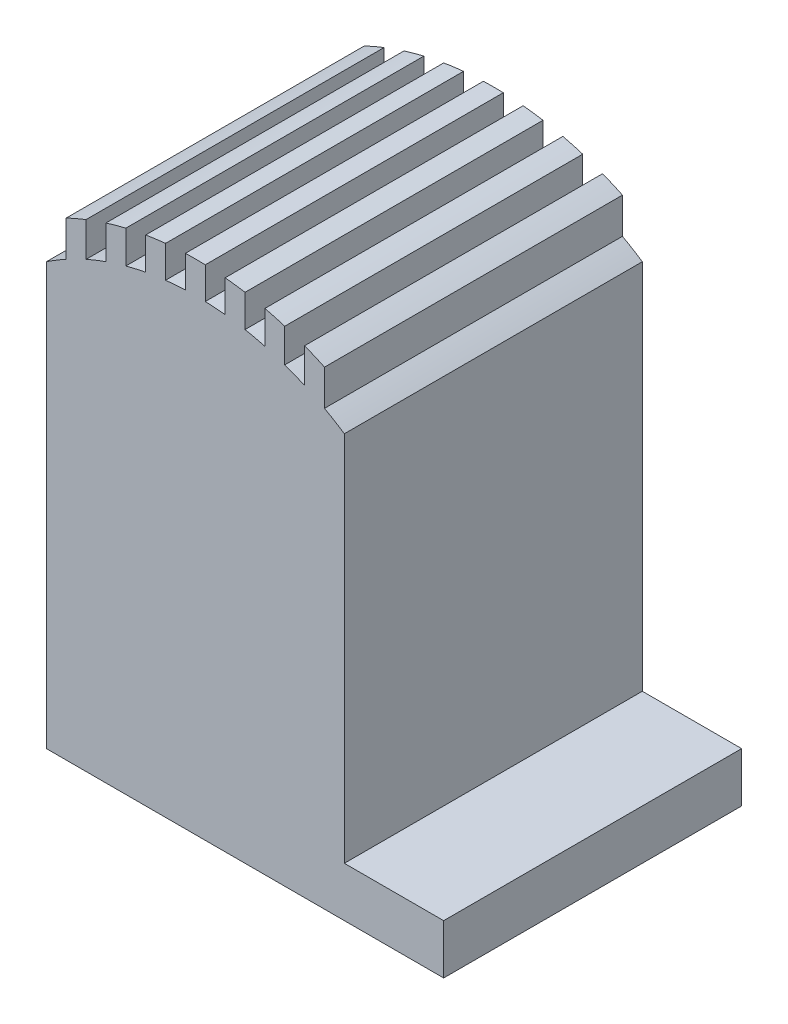
ISO-10303-21;
HEADER;
FILE_DESCRIPTION(('STEP AP214'),'2;1');
FILE_NAME('part.step','',(''),(''),'','','');
FILE_SCHEMA(('AUTOMOTIVE_DESIGN { 1 0 10303 214 1 1 1 1 }'));
ENDSEC;
DATA;
#1=APPLICATION_CONTEXT('core data for automotive mechanical design processes');
#2=APPLICATION_PROTOCOL_DEFINITION('international standard','automotive_design',2000,#1);
#3=PRODUCT_CONTEXT('',#1,'mechanical');
#4=PRODUCT('Part','Part','',(#3));
#5=PRODUCT_RELATED_PRODUCT_CATEGORY('part','',(#4));
#6=PRODUCT_DEFINITION_FORMATION('','',#4);
#7=PRODUCT_DEFINITION_CONTEXT('part definition',#1,'design');
#8=PRODUCT_DEFINITION('design','',#6,#7);
#9=PRODUCT_DEFINITION_SHAPE('','',#8);
#10=(LENGTH_UNIT() NAMED_UNIT(*) SI_UNIT(.MILLI.,.METRE.));
#11=(NAMED_UNIT(*) PLANE_ANGLE_UNIT() SI_UNIT($,.RADIAN.));
#12=(NAMED_UNIT(*) SI_UNIT($,.STERADIAN.) SOLID_ANGLE_UNIT());
#13=UNCERTAINTY_MEASURE_WITH_UNIT(LENGTH_MEASURE(1.E-05),#10,'distance_accuracy_value','');
#14=(GEOMETRIC_REPRESENTATION_CONTEXT(3) GLOBAL_UNCERTAINTY_ASSIGNED_CONTEXT((#13)) GLOBAL_UNIT_ASSIGNED_CONTEXT((#10,
#11,#12)) REPRESENTATION_CONTEXT('',''));
#15=CARTESIAN_POINT('',(0.,0.,0.));
#16=DIRECTION('',(0.,0.,1.));
#17=DIRECTION('',(1.,0.,0.));
#18=AXIS2_PLACEMENT_3D('',#15,#16,#17);
#19=CARTESIAN_POINT('',(-0.635,1.27,-1.905));
#20=DIRECTION('',(0.,0.,1.));
#21=DIRECTION('',(1.,0.,0.));
#22=AXIS2_PLACEMENT_3D('',#19,#20,#21);
#23=PLANE('',#22);
#24=CARTESIAN_POINT('',(-0.635,1.27,-1.905));
#25=DIRECTION('',(0.,0.,1.));
#26=DIRECTION('',(1.,0.,0.));
#27=AXIS2_PLACEMENT_3D('',#24,#25,#26);
#28=CIRCLE('',#27,3.429);
#29=CARTESIAN_POINT('',(-2.286,4.275368529815,-1.905));
#30=VERTEX_POINT('',#29);
#31=CARTESIAN_POINT('',(-2.54,4.121142928722,-1.905));
#32=VERTEX_POINT('',#31);
#33=EDGE_CURVE('E501',#30,#32,#28,.T.);
#34=ORIENTED_EDGE('',*,*,#33,.F.);
#35=DIRECTION('',(0.,-1.,0.));
#36=VECTOR('',#35,1.);
#37=CARTESIAN_POINT('',(-2.286,4.7318625276,-1.905));
#38=LINE('',#37,#36);
#39=CARTESIAN_POINT('',(-2.286,4.7318625276,-1.905));
#40=VERTEX_POINT('',#39);
#41=EDGE_CURVE('E456',#40,#30,#38,.T.);
#42=ORIENTED_EDGE('',*,*,#41,.F.);
#43=CARTESIAN_POINT('',(-0.635,1.27,-1.905));
#44=DIRECTION('',(0.,0.,1.));
#45=DIRECTION('',(1.,0.,0.));
#46=AXIS2_PLACEMENT_3D('',#43,#44,#45);
#47=CIRCLE('',#46,3.8354);
#48=CARTESIAN_POINT('',(-2.032,4.841930032909,-1.905));
#49=VERTEX_POINT('',#48);
#50=EDGE_CURVE('E480',#49,#40,#47,.T.);
#51=ORIENTED_EDGE('',*,*,#50,.F.);
#52=DIRECTION('',(0.,1.,0.));
#53=VECTOR('',#52,1.);
#54=CARTESIAN_POINT('',(-2.032,4.401522313508,-1.905));
#55=LINE('',#54,#53);
#56=CARTESIAN_POINT('',(-2.032,4.401522313508,-1.905));
#57=VERTEX_POINT('',#56);
#58=EDGE_CURVE('E11',#57,#49,#55,.T.);
#59=ORIENTED_EDGE('',*,*,#58,.F.);
#60=CARTESIAN_POINT('',(-0.635,1.27,-1.905));
#61=DIRECTION('',(0.,0.,1.));
#62=DIRECTION('',(1.,0.,0.));
#63=AXIS2_PLACEMENT_3D('',#60,#61,#62);
#64=CIRCLE('',#63,3.429);
#65=CARTESIAN_POINT('',(-1.778,4.502892203585,-1.905));
#66=VERTEX_POINT('',#65);
#67=EDGE_CURVE('E426',#66,#57,#64,.T.);
#68=ORIENTED_EDGE('',*,*,#67,.F.);
#69=DIRECTION('',(0.,-1.,0.));
#70=VECTOR('',#69,1.);
#71=CARTESIAN_POINT('',(-1.778,4.931126078135,-1.905));
#72=LINE('',#71,#70);
#73=CARTESIAN_POINT('',(-1.778,4.931126078135,-1.905));
#74=VERTEX_POINT('',#73);
#75=EDGE_CURVE('E427',#74,#66,#72,.T.);
#76=ORIENTED_EDGE('',*,*,#75,.F.);
#77=CARTESIAN_POINT('',(-0.635,1.269999999999,-1.905));
#78=DIRECTION('',(0.,0.,1.));
#79=DIRECTION('',(1.,0.,0.));
#80=AXIS2_PLACEMENT_3D('',#77,#78,#79);
#81=CIRCLE('',#80,3.8354);
#82=CARTESIAN_POINT('',(-1.524,5.000947890282,-1.905));
#83=VERTEX_POINT('',#82);
#84=EDGE_CURVE('E394',#83,#74,#81,.T.);
#85=ORIENTED_EDGE('',*,*,#84,.F.);
#86=DIRECTION('',(0.,1.,0.));
#87=VECTOR('',#86,1.);
#88=CARTESIAN_POINT('',(-1.524,4.581754821843,-1.905));
#89=LINE('',#88,#87);
#90=CARTESIAN_POINT('',(-1.524,4.581754821843,-1.905));
#91=VERTEX_POINT('',#90);
#92=EDGE_CURVE('E395',#91,#83,#89,.T.);
#93=ORIENTED_EDGE('',*,*,#92,.F.);
#94=CARTESIAN_POINT('',(-0.635,1.27,-1.905));
#95=DIRECTION('',(0.,0.,1.));
#96=DIRECTION('',(1.,0.,0.));
#97=AXIS2_PLACEMENT_3D('',#94,#95,#96);
#98=CIRCLE('',#97,3.429);
#99=CARTESIAN_POINT('',(-1.27,4.639690787001,-1.905));
#100=VERTEX_POINT('',#99);
#101=EDGE_CURVE('E341',#100,#91,#98,.T.);
#102=ORIENTED_EDGE('',*,*,#101,.F.);
#103=DIRECTION('',(0.,-1.,0.));
#104=VECTOR('',#103,1.);
#105=CARTESIAN_POINT('',(-1.27,5.052468527298,-1.905));
#106=LINE('',#105,#104);
#107=CARTESIAN_POINT('',(-1.27,5.052468527298,-1.905));
#108=VERTEX_POINT('',#107);
#109=EDGE_CURVE('E342',#108,#100,#106,.T.);
#110=ORIENTED_EDGE('',*,*,#109,.F.);
#111=CARTESIAN_POINT('',(-0.635,1.269999999999,-1.905));
#112=DIRECTION('',(0.,0.,1.));
#113=DIRECTION('',(1.,0.,0.));
#114=AXIS2_PLACEMENT_3D('',#111,#112,#113);
#115=CIRCLE('',#114,3.8354);
#116=CARTESIAN_POINT('',(-1.016,5.086429242106,-1.905));
#117=VERTEX_POINT('',#116);
#118=EDGE_CURVE('E421',#117,#108,#115,.T.);
#119=ORIENTED_EDGE('',*,*,#118,.F.);
#120=DIRECTION('',(0.,1.,0.));
#121=VECTOR('',#120,1.);
#122=CARTESIAN_POINT('',(-1.016,4.67776759771,-1.905));
#123=LINE('',#122,#121);
#124=CARTESIAN_POINT('',(-1.016,4.67776759771,-1.905));
#125=VERTEX_POINT('',#124);
#126=EDGE_CURVE('E20',#125,#117,#123,.T.);
#127=ORIENTED_EDGE('',*,*,#126,.F.);
#128=CARTESIAN_POINT('',(-0.635,1.27,-1.905));
#129=DIRECTION('',(0.,0.,1.));
#130=DIRECTION('',(1.,0.,0.));
#131=AXIS2_PLACEMENT_3D('',#128,#129,#130);
#132=CIRCLE('',#131,3.429);
#133=CARTESIAN_POINT('',(-0.762,4.696647341061,-1.905));
#134=VERTEX_POINT('',#133);
#135=EDGE_CURVE('E306',#134,#125,#132,.T.);
#136=ORIENTED_EDGE('',*,*,#135,.F.);
#137=DIRECTION('',(0.,-1.,0.));
#138=VECTOR('',#137,1.);
#139=CARTESIAN_POINT('',(-0.762,5.103296774318,-1.905));
#140=LINE('',#139,#138);
#141=CARTESIAN_POINT('',(-0.762,5.103296774318,-1.905));
#142=VERTEX_POINT('',#141);
#143=EDGE_CURVE('E389',#142,#134,#140,.T.);
#144=ORIENTED_EDGE('',*,*,#143,.F.);
#145=CARTESIAN_POINT('',(-0.635,1.270000000001,-1.905));
#146=DIRECTION('',(0.,0.,1.));
#147=DIRECTION('',(1.,0.,0.));
#148=AXIS2_PLACEMENT_3D('',#145,#146,#147);
#149=CIRCLE('',#148,3.8354);
#150=CARTESIAN_POINT('',(-0.508,5.103296774318,-1.905));
#151=VERTEX_POINT('',#150);
#152=EDGE_CURVE('E464',#151,#142,#149,.T.);
#153=ORIENTED_EDGE('',*,*,#152,.F.);
#154=DIRECTION('',(0.,1.,0.));
#155=VECTOR('',#154,1.);
#156=CARTESIAN_POINT('',(-0.508,4.696647341061,-1.905));
#157=LINE('',#156,#155);
#158=CARTESIAN_POINT('',(-0.508,4.696647341061,-1.905));
#159=VERTEX_POINT('',#158);
#160=EDGE_CURVE('E572',#159,#151,#157,.T.);
#161=ORIENTED_EDGE('',*,*,#160,.F.);
#162=CARTESIAN_POINT('',(-0.635,1.270000000001,-1.905));
#163=DIRECTION('',(0.,0.,1.));
#164=DIRECTION('',(1.,0.,0.));
#165=AXIS2_PLACEMENT_3D('',#162,#163,#164);
#166=CIRCLE('',#165,3.429);
#167=CARTESIAN_POINT('',(-0.254,4.67776759771,-1.905));
#168=VERTEX_POINT('',#167);
#169=EDGE_CURVE('E492',#168,#159,#166,.T.);
#170=ORIENTED_EDGE('',*,*,#169,.F.);
#171=DIRECTION('',(0.,-1.,0.));
#172=VECTOR('',#171,1.);
#173=CARTESIAN_POINT('',(-0.254,5.086429242106,-1.905));
#174=LINE('',#173,#172);
#175=CARTESIAN_POINT('',(-0.254,5.086429242106,-1.905));
#176=VERTEX_POINT('',#175);
#177=EDGE_CURVE('E493',#176,#168,#174,.T.);
#178=ORIENTED_EDGE('',*,*,#177,.F.);
#179=CARTESIAN_POINT('',(-0.635,1.270000000001,-1.905));
#180=DIRECTION('',(0.,0.,1.));
#181=DIRECTION('',(1.,0.,0.));
#182=AXIS2_PLACEMENT_3D('',#179,#180,#181);
#183=CIRCLE('',#182,3.8354);
#184=CARTESIAN_POINT('',(0.,5.052468527298,-1.905));
#185=VERTEX_POINT('',#184);
#186=EDGE_CURVE('E432',#185,#176,#183,.T.);
#187=ORIENTED_EDGE('',*,*,#186,.F.);
#188=DIRECTION('',(0.,1.,0.));
#189=VECTOR('',#188,1.);
#190=CARTESIAN_POINT('',(0.,4.639690787001,-1.905));
#191=LINE('',#190,#189);
#192=CARTESIAN_POINT('',(0.,4.639690787001,-1.905));
#193=VERTEX_POINT('',#192);
#194=EDGE_CURVE('E433',#193,#185,#191,.T.);
#195=ORIENTED_EDGE('',*,*,#194,.F.);
#196=CARTESIAN_POINT('',(-0.635,1.269999999999,-1.905));
#197=DIRECTION('',(0.,0.,1.));
#198=DIRECTION('',(1.,0.,0.));
#199=AXIS2_PLACEMENT_3D('',#196,#197,#198);
#200=CIRCLE('',#199,3.429);
#201=CARTESIAN_POINT('',(0.254,4.581754821843,-1.905));
#202=VERTEX_POINT('',#201);
#203=EDGE_CURVE('E319',#202,#193,#200,.T.);
#204=ORIENTED_EDGE('',*,*,#203,.F.);
#205=DIRECTION('',(0.,-1.,0.));
#206=VECTOR('',#205,1.);
#207=CARTESIAN_POINT('',(0.254,5.000947890282,-1.905));
#208=LINE('',#207,#206);
#209=CARTESIAN_POINT('',(0.254,5.000947890282,-1.905));
#210=VERTEX_POINT('',#209);
#211=EDGE_CURVE('E434',#210,#202,#208,.T.);
#212=ORIENTED_EDGE('',*,*,#211,.F.);
#213=CARTESIAN_POINT('',(-0.635,1.269999999999,-1.905));
#214=DIRECTION('',(0.,0.,1.));
#215=DIRECTION('',(1.,0.,0.));
#216=AXIS2_PLACEMENT_3D('',#213,#214,#215);
#217=CIRCLE('',#216,3.8354);
#218=CARTESIAN_POINT('',(0.508,4.931126078135,-1.905));
#219=VERTEX_POINT('',#218);
#220=EDGE_CURVE('E357',#219,#210,#217,.T.);
#221=ORIENTED_EDGE('',*,*,#220,.F.);
#222=DIRECTION('',(0.,1.,0.));
#223=VECTOR('',#222,1.);
#224=CARTESIAN_POINT('',(0.508,4.502892203585,-1.905));
#225=LINE('',#224,#223);
#226=CARTESIAN_POINT('',(0.508,4.502892203585,-1.905));
#227=VERTEX_POINT('',#226);
#228=EDGE_CURVE('E358',#227,#219,#225,.T.);
#229=ORIENTED_EDGE('',*,*,#228,.F.);
#230=CARTESIAN_POINT('',(-0.635,1.269999999999,-1.905));
#231=DIRECTION('',(0.,0.,1.));
#232=DIRECTION('',(1.,0.,0.));
#233=AXIS2_PLACEMENT_3D('',#230,#231,#232);
#234=CIRCLE('',#233,3.429);
#235=CARTESIAN_POINT('',(0.762,4.401522313508,-1.905));
#236=VERTEX_POINT('',#235);
#237=EDGE_CURVE('E451',#236,#227,#234,.T.);
#238=ORIENTED_EDGE('',*,*,#237,.F.);
#239=DIRECTION('',(0.,-1.,0.));
#240=VECTOR('',#239,1.);
#241=CARTESIAN_POINT('',(0.762,4.841930032909,-1.905));
#242=LINE('',#241,#240);
#243=CARTESIAN_POINT('',(0.762,4.841930032909,-1.905));
#244=VERTEX_POINT('',#243);
#245=EDGE_CURVE('E557',#244,#236,#242,.T.);
#246=ORIENTED_EDGE('',*,*,#245,.F.);
#247=CARTESIAN_POINT('',(-0.635000000001,1.269999999998,-1.905));
#248=DIRECTION('',(0.,0.,1.));
#249=DIRECTION('',(1.,0.,0.));
#250=AXIS2_PLACEMENT_3D('',#247,#248,#249);
#251=CIRCLE('',#250,3.8354);
#252=CARTESIAN_POINT('',(1.016,4.7318625276,-1.905));
#253=VERTEX_POINT('',#252);
#254=EDGE_CURVE('E413',#253,#244,#251,.T.);
#255=ORIENTED_EDGE('',*,*,#254,.F.);
#256=DIRECTION('',(0.,1.,0.));
#257=VECTOR('',#256,1.);
#258=CARTESIAN_POINT('',(1.016,4.275368529815,-1.905));
#259=LINE('',#258,#257);
#260=CARTESIAN_POINT('',(1.016,4.275368529815,-1.905));
#261=VERTEX_POINT('',#260);
#262=EDGE_CURVE('E403',#261,#253,#259,.T.);
#263=ORIENTED_EDGE('',*,*,#262,.F.);
#264=CARTESIAN_POINT('',(-0.635,1.27,-1.905));
#265=DIRECTION('',(0.,0.,1.));
#266=DIRECTION('',(1.,0.,0.));
#267=AXIS2_PLACEMENT_3D('',#264,#265,#266);
#268=CIRCLE('',#267,3.429);
#269=CARTESIAN_POINT('',(1.27,4.121142928722,-1.905));
#270=VERTEX_POINT('',#269);
#271=EDGE_CURVE('E265',#270,#261,#268,.T.);
#272=ORIENTED_EDGE('',*,*,#271,.F.);
#273=DIRECTION('',(0.,1.,0.));
#274=VECTOR('',#273,1.);
#275=CARTESIAN_POINT('',(1.27,-0.635,-1.905));
#276=LINE('',#275,#274);
#277=CARTESIAN_POINT('',(1.27,-0.635,-1.905));
#278=VERTEX_POINT('',#277);
#279=EDGE_CURVE('E259',#278,#270,#276,.T.);
#280=ORIENTED_EDGE('',*,*,#279,.F.);
#281=DIRECTION('',(-1.,0.,0.));
#282=VECTOR('',#281,1.);
#283=CARTESIAN_POINT('',(2.54,-0.635,-1.905));
#284=LINE('',#283,#282);
#285=CARTESIAN_POINT('',(2.54,-0.635,-1.905));
#286=VERTEX_POINT('',#285);
#287=EDGE_CURVE('E262',#286,#278,#284,.T.);
#288=ORIENTED_EDGE('',*,*,#287,.F.);
#289=DIRECTION('',(0.,1.,0.));
#290=VECTOR('',#289,1.);
#291=CARTESIAN_POINT('',(2.54,-1.27,-1.905));
#292=LINE('',#291,#290);
#293=CARTESIAN_POINT('',(2.54,-1.27,-1.905));
#294=VERTEX_POINT('',#293);
#295=EDGE_CURVE('E291',#294,#286,#292,.T.);
#296=ORIENTED_EDGE('',*,*,#295,.F.);
#297=DIRECTION('',(1.,0.,0.));
#298=VECTOR('',#297,1.);
#299=CARTESIAN_POINT('',(-2.54,-1.27,-1.905));
#300=LINE('',#299,#298);
#301=CARTESIAN_POINT('',(-2.54,-1.27,-1.905));
#302=VERTEX_POINT('',#301);
#303=EDGE_CURVE('E362',#302,#294,#300,.T.);
#304=ORIENTED_EDGE('',*,*,#303,.F.);
#305=DIRECTION('',(0.,-1.,0.));
#306=VECTOR('',#305,1.);
#307=CARTESIAN_POINT('',(-2.54,4.121142928722,-1.905));
#308=LINE('',#307,#306);
#309=EDGE_CURVE('E380',#32,#302,#308,.T.);
#310=ORIENTED_EDGE('',*,*,#309,.F.);
#311=EDGE_LOOP('',(#34,#42,#51,#59,#68,#76,#85,#93,#102,#110,#119,#127,#136,#144,#153,#161,#170,
#178,#187,#195,#204,#212,#221,#229,#238,#246,#255,#263,#272,#280,#288,#296,#304,#310));
#312=FACE_BOUND('',#311,.T.);
#313=ADVANCED_FACE('F16',(#312),#23,.F.);
#314=CARTESIAN_POINT('',(-2.032,4.401522313508,1.905));
#315=DIRECTION('',(-1.,0.,0.));
#316=DIRECTION('',(0.,0.,1.));
#317=AXIS2_PLACEMENT_3D('',#314,#315,#316);
#318=PLANE('',#317);
#319=ORIENTED_EDGE('',*,*,#58,.T.);
#320=DIRECTION('',(0.,0.,-1.));
#321=VECTOR('',#320,1.);
#322=CARTESIAN_POINT('',(-2.032,4.841930032909,1.905));
#323=LINE('',#322,#321);
#324=CARTESIAN_POINT('',(-2.032,4.841930032909,1.905));
#325=VERTEX_POINT('',#324);
#326=EDGE_CURVE('E497',#325,#49,#323,.T.);
#327=ORIENTED_EDGE('',*,*,#326,.F.);
#328=DIRECTION('',(0.,1.,0.));
#329=VECTOR('',#328,1.);
#330=CARTESIAN_POINT('',(-2.032,4.401522313508,1.905));
#331=LINE('',#330,#329);
#332=CARTESIAN_POINT('',(-2.032,4.401522313508,1.905));
#333=VERTEX_POINT('',#332);
#334=EDGE_CURVE('E307',#333,#325,#331,.T.);
#335=ORIENTED_EDGE('',*,*,#334,.F.);
#336=DIRECTION('',(0.,0.,-1.));
#337=VECTOR('',#336,1.);
#338=CARTESIAN_POINT('',(-2.032,4.401522313508,1.905));
#339=LINE('',#338,#337);
#340=EDGE_CURVE('E27',#333,#57,#339,.T.);
#341=ORIENTED_EDGE('',*,*,#340,.T.);
#342=EDGE_LOOP('',(#319,#327,#335,#341));
#343=FACE_BOUND('',#342,.T.);
#344=ADVANCED_FACE('F629',(#343),#318,.F.);
#345=CARTESIAN_POINT('',(-0.635,1.27,1.905));
#346=DIRECTION('',(0.,0.,1.));
#347=DIRECTION('',(-1.,0.,0.));
#348=AXIS2_PLACEMENT_3D('',#345,#346,#347);
#349=CYLINDRICAL_SURFACE('',#348,3.429);
#350=ORIENTED_EDGE('',*,*,#67,.T.);
#351=ORIENTED_EDGE('',*,*,#340,.F.);
#352=CARTESIAN_POINT('',(-0.635,1.27,1.905));
#353=DIRECTION('',(0.,0.,1.));
#354=DIRECTION('',(1.,0.,0.));
#355=AXIS2_PLACEMENT_3D('',#352,#353,#354);
#356=CIRCLE('',#355,3.429);
#357=CARTESIAN_POINT('',(-1.778,4.502892203585,1.905));
#358=VERTEX_POINT('',#357);
#359=EDGE_CURVE('E312',#358,#333,#356,.T.);
#360=ORIENTED_EDGE('',*,*,#359,.F.);
#361=DIRECTION('',(0.,0.,-1.));
#362=VECTOR('',#361,1.);
#363=CARTESIAN_POINT('',(-1.778,4.502892203585,1.905));
#364=LINE('',#363,#362);
#365=EDGE_CURVE('E422',#358,#66,#364,.T.);
#366=ORIENTED_EDGE('',*,*,#365,.T.);
#367=EDGE_LOOP('',(#350,#351,#360,#366));
#368=FACE_BOUND('',#367,.T.);
#369=ADVANCED_FACE('F632',(#368),#349,.T.);
#370=CARTESIAN_POINT('',(-1.778,4.931126078135,1.905));
#371=DIRECTION('',(1.,0.,0.));
#372=DIRECTION('',(0.,1.,0.));
#373=AXIS2_PLACEMENT_3D('',#370,#371,#372);
#374=PLANE('',#373);
#375=ORIENTED_EDGE('',*,*,#75,.T.);
#376=ORIENTED_EDGE('',*,*,#365,.F.);
#377=DIRECTION('',(0.,-1.,0.));
#378=VECTOR('',#377,1.);
#379=CARTESIAN_POINT('',(-1.778,4.931126078135,1.905));
#380=LINE('',#379,#378);
#381=CARTESIAN_POINT('',(-1.778,4.931126078135,1.905));
#382=VERTEX_POINT('',#381);
#383=EDGE_CURVE('E399',#382,#358,#380,.T.);
#384=ORIENTED_EDGE('',*,*,#383,.F.);
#385=DIRECTION('',(0.,0.,-1.));
#386=VECTOR('',#385,1.);
#387=CARTESIAN_POINT('',(-1.778,4.931126078135,1.905));
#388=LINE('',#387,#386);
#389=EDGE_CURVE('E595',#382,#74,#388,.T.);
#390=ORIENTED_EDGE('',*,*,#389,.T.);
#391=EDGE_LOOP('',(#375,#376,#384,#390));
#392=FACE_BOUND('',#391,.T.);
#393=ADVANCED_FACE('F18',(#392),#374,.F.);
#394=CARTESIAN_POINT('',(-0.635,1.269999999999,1.905));
#395=DIRECTION('',(0.,0.,1.));
#396=DIRECTION('',(-1.,0.,0.));
#397=AXIS2_PLACEMENT_3D('',#394,#395,#396);
#398=CYLINDRICAL_SURFACE('',#397,3.8354);
#399=ORIENTED_EDGE('',*,*,#84,.T.);
#400=ORIENTED_EDGE('',*,*,#389,.F.);
#401=CARTESIAN_POINT('',(-0.635,1.269999999999,1.905));
#402=DIRECTION('',(0.,0.,1.));
#403=DIRECTION('',(1.,0.,0.));
#404=AXIS2_PLACEMENT_3D('',#401,#402,#403);
#405=CIRCLE('',#404,3.8354);
#406=CARTESIAN_POINT('',(-1.524,5.000947890282,1.905));
#407=VERTEX_POINT('',#406);
#408=EDGE_CURVE('E317',#407,#382,#405,.T.);
#409=ORIENTED_EDGE('',*,*,#408,.F.);
#410=DIRECTION('',(0.,0.,-1.));
#411=VECTOR('',#410,1.);
#412=CARTESIAN_POINT('',(-1.524,5.000947890282,1.905));
#413=LINE('',#412,#411);
#414=EDGE_CURVE('E390',#407,#83,#413,.T.);
#415=ORIENTED_EDGE('',*,*,#414,.T.);
#416=EDGE_LOOP('',(#399,#400,#409,#415));
#417=FACE_BOUND('',#416,.T.);
#418=ADVANCED_FACE('F643',(#417),#398,.T.);
#419=CARTESIAN_POINT('',(-1.524,4.581754821843,1.905));
#420=DIRECTION('',(-1.,0.,0.));
#421=DIRECTION('',(0.,0.,1.));
#422=AXIS2_PLACEMENT_3D('',#419,#420,#421);
#423=PLANE('',#422);
#424=ORIENTED_EDGE('',*,*,#92,.T.);
#425=ORIENTED_EDGE('',*,*,#414,.F.);
#426=DIRECTION('',(0.,1.,0.));
#427=VECTOR('',#426,1.);
#428=CARTESIAN_POINT('',(-1.524,4.581754821843,1.905));
#429=LINE('',#428,#427);
#430=CARTESIAN_POINT('',(-1.524,4.581754821843,1.905));
#431=VERTEX_POINT('',#430);
#432=EDGE_CURVE('E313',#431,#407,#429,.T.);
#433=ORIENTED_EDGE('',*,*,#432,.F.);
#434=DIRECTION('',(0.,0.,-1.));
#435=VECTOR('',#434,1.);
#436=CARTESIAN_POINT('',(-1.524,4.581754821843,1.905));
#437=LINE('',#436,#435);
#438=EDGE_CURVE('E476',#431,#91,#437,.T.);
#439=ORIENTED_EDGE('',*,*,#438,.T.);
#440=EDGE_LOOP('',(#424,#425,#433,#439));
#441=FACE_BOUND('',#440,.T.);
#442=ADVANCED_FACE('F826',(#441),#423,.F.);
#443=CARTESIAN_POINT('',(-0.635,1.27,1.905));
#444=DIRECTION('',(0.,0.,1.));
#445=DIRECTION('',(-1.,0.,0.));
#446=AXIS2_PLACEMENT_3D('',#443,#444,#445);
#447=CYLINDRICAL_SURFACE('',#446,3.429);
#448=ORIENTED_EDGE('',*,*,#101,.T.);
#449=ORIENTED_EDGE('',*,*,#438,.F.);
#450=CARTESIAN_POINT('',(-0.635,1.27,1.905));
#451=DIRECTION('',(0.,0.,1.));
#452=DIRECTION('',(1.,0.,0.));
#453=AXIS2_PLACEMENT_3D('',#450,#451,#452);
#454=CIRCLE('',#453,3.429);
#455=CARTESIAN_POINT('',(-1.27,4.639690787001,1.905));
#456=VERTEX_POINT('',#455);
#457=EDGE_CURVE('E318',#456,#431,#454,.T.);
#458=ORIENTED_EDGE('',*,*,#457,.F.);
#459=DIRECTION('',(0.,0.,-1.));
#460=VECTOR('',#459,1.);
#461=CARTESIAN_POINT('',(-1.27,4.639690787001,1.905));
#462=LINE('',#461,#460);
#463=EDGE_CURVE('E337',#456,#100,#462,.T.);
#464=ORIENTED_EDGE('',*,*,#463,.T.);
#465=EDGE_LOOP('',(#448,#449,#458,#464));
#466=FACE_BOUND('',#465,.T.);
#467=ADVANCED_FACE('F823',(#466),#447,.T.);
#468=CARTESIAN_POINT('',(-1.27,5.052468527298,1.905));
#469=DIRECTION('',(1.,0.,0.));
#470=DIRECTION('',(0.,1.,0.));
#471=AXIS2_PLACEMENT_3D('',#468,#469,#470);
#472=PLANE('',#471);
#473=ORIENTED_EDGE('',*,*,#109,.T.);
#474=ORIENTED_EDGE('',*,*,#463,.F.);
#475=DIRECTION('',(0.,-1.,0.));
#476=VECTOR('',#475,1.);
#477=CARTESIAN_POINT('',(-1.27,5.052468527298,1.905));
#478=LINE('',#477,#476);
#479=CARTESIAN_POINT('',(-1.27,5.052468527298,1.905));
#480=VERTEX_POINT('',#479);
#481=EDGE_CURVE('E445',#480,#456,#478,.T.);
#482=ORIENTED_EDGE('',*,*,#481,.F.);
#483=DIRECTION('',(0.,0.,-1.));
#484=VECTOR('',#483,1.);
#485=CARTESIAN_POINT('',(-1.27,5.052468527298,1.905));
#486=LINE('',#485,#484);
#487=EDGE_CURVE('E417',#480,#108,#486,.T.);
#488=ORIENTED_EDGE('',*,*,#487,.T.);
#489=EDGE_LOOP('',(#473,#474,#482,#488));
#490=FACE_BOUND('',#489,.T.);
#491=ADVANCED_FACE('F820',(#490),#472,.F.);
#492=CARTESIAN_POINT('',(-0.635,1.269999999999,1.905));
#493=DIRECTION('',(0.,0.,1.));
#494=DIRECTION('',(-1.,0.,0.));
#495=AXIS2_PLACEMENT_3D('',#492,#493,#494);
#496=CYLINDRICAL_SURFACE('',#495,3.8354);
#497=ORIENTED_EDGE('',*,*,#118,.T.);
#498=ORIENTED_EDGE('',*,*,#487,.F.);
#499=CARTESIAN_POINT('',(-0.635,1.269999999999,1.905));
#500=DIRECTION('',(0.,0.,1.));
#501=DIRECTION('',(1.,0.,0.));
#502=AXIS2_PLACEMENT_3D('',#499,#500,#501);
#503=CIRCLE('',#502,3.8354);
#504=CARTESIAN_POINT('',(-1.016,5.086429242106,1.905));
#505=VERTEX_POINT('',#504);
#506=EDGE_CURVE('E547',#505,#480,#503,.T.);
#507=ORIENTED_EDGE('',*,*,#506,.F.);
#508=DIRECTION('',(0.,0.,-1.));
#509=VECTOR('',#508,1.);
#510=CARTESIAN_POINT('',(-1.016,5.086429242106,1.905));
#511=LINE('',#510,#509);
#512=EDGE_CURVE('E455',#505,#117,#511,.T.);
#513=ORIENTED_EDGE('',*,*,#512,.T.);
#514=EDGE_LOOP('',(#497,#498,#507,#513));
#515=FACE_BOUND('',#514,.T.);
#516=ADVANCED_FACE('F818',(#515),#496,.T.);
#517=CARTESIAN_POINT('',(-1.016,4.67776759771,1.905));
#518=DIRECTION('',(-1.,0.,0.));
#519=DIRECTION('',(0.,0.,1.));
#520=AXIS2_PLACEMENT_3D('',#517,#518,#519);
#521=PLANE('',#520);
#522=ORIENTED_EDGE('',*,*,#126,.T.);
#523=ORIENTED_EDGE('',*,*,#512,.F.);
#524=DIRECTION('',(0.,1.,0.));
#525=VECTOR('',#524,1.);
#526=CARTESIAN_POINT('',(-1.016,4.67776759771,1.905));
#527=LINE('',#526,#525);
#528=CARTESIAN_POINT('',(-1.016,4.67776759771,1.905));
#529=VERTEX_POINT('',#528);
#530=EDGE_CURVE('E543',#529,#505,#527,.T.);
#531=ORIENTED_EDGE('',*,*,#530,.F.);
#532=DIRECTION('',(0.,0.,-1.));
#533=VECTOR('',#532,1.);
#534=CARTESIAN_POINT('',(-1.016,4.67776759771,1.905));
#535=LINE('',#534,#533);
#536=EDGE_CURVE('E302',#529,#125,#535,.T.);
#537=ORIENTED_EDGE('',*,*,#536,.T.);
#538=EDGE_LOOP('',(#522,#523,#531,#537));
#539=FACE_BOUND('',#538,.T.);
#540=ADVANCED_FACE('F796',(#539),#521,.F.);
#541=CARTESIAN_POINT('',(-0.635,1.27,1.905));
#542=DIRECTION('',(0.,0.,1.));
#543=DIRECTION('',(-1.,0.,0.));
#544=AXIS2_PLACEMENT_3D('',#541,#542,#543);
#545=CYLINDRICAL_SURFACE('',#544,3.429);
#546=ORIENTED_EDGE('',*,*,#135,.T.);
#547=ORIENTED_EDGE('',*,*,#536,.F.);
#548=CARTESIAN_POINT('',(-0.635,1.27,1.905));
#549=DIRECTION('',(0.,0.,1.));
#550=DIRECTION('',(1.,0.,0.));
#551=AXIS2_PLACEMENT_3D('',#548,#549,#550);
#552=CIRCLE('',#551,3.429);
#553=CARTESIAN_POINT('',(-0.762,4.696647341061,1.905));
#554=VERTEX_POINT('',#553);
#555=EDGE_CURVE('E463',#554,#529,#552,.T.);
#556=ORIENTED_EDGE('',*,*,#555,.F.);
#557=DIRECTION('',(0.,0.,-1.));
#558=VECTOR('',#557,1.);
#559=CARTESIAN_POINT('',(-0.762,4.696647341061,1.905));
#560=LINE('',#559,#558);
#561=EDGE_CURVE('E386',#554,#134,#560,.T.);
#562=ORIENTED_EDGE('',*,*,#561,.T.);
#563=EDGE_LOOP('',(#546,#547,#556,#562));
#564=FACE_BOUND('',#563,.T.);
#565=ADVANCED_FACE('F793',(#564),#545,.T.);
#566=CARTESIAN_POINT('',(-0.762,5.103296774318,1.905));
#567=DIRECTION('',(1.,0.,0.));
#568=DIRECTION('',(0.,1.,0.));
#569=AXIS2_PLACEMENT_3D('',#566,#567,#568);
#570=PLANE('',#569);
#571=ORIENTED_EDGE('',*,*,#143,.T.);
#572=ORIENTED_EDGE('',*,*,#561,.F.);
#573=DIRECTION('',(0.,-1.,0.));
#574=VECTOR('',#573,1.);
#575=CARTESIAN_POINT('',(-0.762,5.103296774318,1.905));
#576=LINE('',#575,#574);
#577=CARTESIAN_POINT('',(-0.762,5.103296774318,1.905));
#578=VERTEX_POINT('',#577);
#579=EDGE_CURVE('E347',#578,#554,#576,.T.);
#580=ORIENTED_EDGE('',*,*,#579,.F.);
#581=DIRECTION('',(0.,0.,-1.));
#582=VECTOR('',#581,1.);
#583=CARTESIAN_POINT('',(-0.762,5.103296774318,1.905));
#584=LINE('',#583,#582);
#585=EDGE_CURVE('E468',#578,#142,#584,.T.);
#586=ORIENTED_EDGE('',*,*,#585,.T.);
#587=EDGE_LOOP('',(#571,#572,#580,#586));
#588=FACE_BOUND('',#587,.T.);
#589=ADVANCED_FACE('F789',(#588),#570,.F.);
#590=CARTESIAN_POINT('',(-0.635,1.270000000001,1.905));
#591=DIRECTION('',(0.,0.,1.));
#592=DIRECTION('',(-1.,0.,0.));
#593=AXIS2_PLACEMENT_3D('',#590,#591,#592);
#594=CYLINDRICAL_SURFACE('',#593,3.8354);
#595=ORIENTED_EDGE('',*,*,#152,.T.);
#596=ORIENTED_EDGE('',*,*,#585,.F.);
#597=CARTESIAN_POINT('',(-0.635,1.270000000001,1.905));
#598=DIRECTION('',(0.,0.,1.));
#599=DIRECTION('',(1.,0.,0.));
#600=AXIS2_PLACEMENT_3D('',#597,#598,#599);
#601=CIRCLE('',#600,3.8354);
#602=CARTESIAN_POINT('',(-0.508,5.103296774318,1.905));
#603=VERTEX_POINT('',#602);
#604=EDGE_CURVE('E343',#603,#578,#601,.T.);
#605=ORIENTED_EDGE('',*,*,#604,.F.);
#606=DIRECTION('',(0.,0.,-1.));
#607=VECTOR('',#606,1.);
#608=CARTESIAN_POINT('',(-0.508,5.103296774318,1.905));
#609=LINE('',#608,#607);
#610=EDGE_CURVE('E469',#603,#151,#609,.T.);
#611=ORIENTED_EDGE('',*,*,#610,.T.);
#612=EDGE_LOOP('',(#595,#596,#605,#611));
#613=FACE_BOUND('',#612,.T.);
#614=ADVANCED_FACE('F792',(#613),#594,.T.);
#615=CARTESIAN_POINT('',(-0.508,4.696647341061,1.905));
#616=DIRECTION('',(-1.,0.,0.));
#617=DIRECTION('',(0.,0.,1.));
#618=AXIS2_PLACEMENT_3D('',#615,#616,#617);
#619=PLANE('',#618);
#620=ORIENTED_EDGE('',*,*,#160,.T.);
#621=ORIENTED_EDGE('',*,*,#610,.F.);
#622=DIRECTION('',(0.,1.,0.));
#623=VECTOR('',#622,1.);
#624=CARTESIAN_POINT('',(-0.508,4.696647341061,1.905));
#625=LINE('',#624,#623);
#626=CARTESIAN_POINT('',(-0.508,4.696647341061,1.905));
#627=VERTEX_POINT('',#626);
#628=EDGE_CURVE('E348',#627,#603,#625,.T.);
#629=ORIENTED_EDGE('',*,*,#628,.F.);
#630=DIRECTION('',(0.,0.,-1.));
#631=VECTOR('',#630,1.);
#632=CARTESIAN_POINT('',(-0.508,4.696647341061,1.905));
#633=LINE('',#632,#631);
#634=EDGE_CURVE('E588',#627,#159,#633,.T.);
#635=ORIENTED_EDGE('',*,*,#634,.T.);
#636=EDGE_LOOP('',(#620,#621,#629,#635));
#637=FACE_BOUND('',#636,.T.);
#638=ADVANCED_FACE('F800',(#637),#619,.F.);
#639=CARTESIAN_POINT('',(-0.635,1.270000000001,1.905));
#640=DIRECTION('',(0.,0.,1.));
#641=DIRECTION('',(-1.,0.,0.));
#642=AXIS2_PLACEMENT_3D('',#639,#640,#641);
#643=CYLINDRICAL_SURFACE('',#642,3.429);
#644=ORIENTED_EDGE('',*,*,#169,.T.);
#645=ORIENTED_EDGE('',*,*,#634,.F.);
#646=CARTESIAN_POINT('',(-0.635,1.270000000001,1.905));
#647=DIRECTION('',(0.,0.,1.));
#648=DIRECTION('',(1.,0.,0.));
#649=AXIS2_PLACEMENT_3D('',#646,#647,#648);
#650=CIRCLE('',#649,3.429);
#651=CARTESIAN_POINT('',(-0.254,4.67776759771,1.905));
#652=VERTEX_POINT('',#651);
#653=EDGE_CURVE('E442',#652,#627,#650,.T.);
#654=ORIENTED_EDGE('',*,*,#653,.F.);
#655=DIRECTION('',(0.,0.,-1.));
#656=VECTOR('',#655,1.);
#657=CARTESIAN_POINT('',(-0.254,4.67776759771,1.905));
#658=LINE('',#657,#656);
#659=EDGE_CURVE('E488',#652,#168,#658,.T.);
#660=ORIENTED_EDGE('',*,*,#659,.T.);
#661=EDGE_LOOP('',(#644,#645,#654,#660));
#662=FACE_BOUND('',#661,.T.);
#663=ADVANCED_FACE('F798',(#662),#643,.T.);
#664=CARTESIAN_POINT('',(-0.254,5.086429242106,1.905));
#665=DIRECTION('',(1.,0.,0.));
#666=DIRECTION('',(0.,1.,0.));
#667=AXIS2_PLACEMENT_3D('',#664,#665,#666);
#668=PLANE('',#667);
#669=ORIENTED_EDGE('',*,*,#177,.T.);
#670=ORIENTED_EDGE('',*,*,#659,.F.);
#671=DIRECTION('',(0.,-1.,0.));
#672=VECTOR('',#671,1.);
#673=CARTESIAN_POINT('',(-0.254,5.086429242106,1.905));
#674=LINE('',#673,#672);
#675=CARTESIAN_POINT('',(-0.254,5.086429242106,1.905));
#676=VERTEX_POINT('',#675);
#677=EDGE_CURVE('E481',#676,#652,#674,.T.);
#678=ORIENTED_EDGE('',*,*,#677,.F.);
#679=DIRECTION('',(0.,0.,-1.));
#680=VECTOR('',#679,1.);
#681=CARTESIAN_POINT('',(-0.254,5.086429242106,1.905));
#682=LINE('',#681,#680);
#683=EDGE_CURVE('E522',#676,#176,#682,.T.);
#684=ORIENTED_EDGE('',*,*,#683,.T.);
#685=EDGE_LOOP('',(#669,#670,#678,#684));
#686=FACE_BOUND('',#685,.T.);
#687=ADVANCED_FACE('F718',(#686),#668,.F.);
#688=CARTESIAN_POINT('',(-0.635,1.270000000001,1.905));
#689=DIRECTION('',(0.,0.,1.));
#690=DIRECTION('',(-1.,0.,0.));
#691=AXIS2_PLACEMENT_3D('',#688,#689,#690);
#692=CYLINDRICAL_SURFACE('',#691,3.8354);
#693=ORIENTED_EDGE('',*,*,#186,.T.);
#694=ORIENTED_EDGE('',*,*,#683,.F.);
#695=CARTESIAN_POINT('',(-0.635,1.270000000001,1.905));
#696=DIRECTION('',(0.,0.,1.));
#697=DIRECTION('',(1.,0.,0.));
#698=AXIS2_PLACEMENT_3D('',#695,#696,#697);
#699=CIRCLE('',#698,3.8354);
#700=CARTESIAN_POINT('',(0.,5.052468527298,1.905));
#701=VERTEX_POINT('',#700);
#702=EDGE_CURVE('E485',#701,#676,#699,.T.);
#703=ORIENTED_EDGE('',*,*,#702,.F.);
#704=DIRECTION('',(0.,0.,-1.));
#705=VECTOR('',#704,1.);
#706=CARTESIAN_POINT('',(0.,5.052468527298,1.905));
#707=LINE('',#706,#705);
#708=EDGE_CURVE('E428',#701,#185,#707,.T.);
#709=ORIENTED_EDGE('',*,*,#708,.T.);
#710=EDGE_LOOP('',(#693,#694,#703,#709));
#711=FACE_BOUND('',#710,.T.);
#712=ADVANCED_FACE('F711',(#711),#692,.T.);
#713=CARTESIAN_POINT('',(0.,4.639690787001,1.905));
#714=DIRECTION('',(-1.,0.,0.));
#715=DIRECTION('',(0.,0.,1.));
#716=AXIS2_PLACEMENT_3D('',#713,#714,#715);
#717=PLANE('',#716);
#718=ORIENTED_EDGE('',*,*,#194,.T.);
#719=ORIENTED_EDGE('',*,*,#708,.F.);
#720=DIRECTION('',(0.,1.,0.));
#721=VECTOR('',#720,1.);
#722=CARTESIAN_POINT('',(0.,4.639690787001,1.905));
#723=LINE('',#722,#721);
#724=CARTESIAN_POINT('',(0.,4.639690787001,1.905));
#725=VERTEX_POINT('',#724);
#726=EDGE_CURVE('E518',#725,#701,#723,.T.);
#727=ORIENTED_EDGE('',*,*,#726,.F.);
#728=DIRECTION('',(0.,0.,-1.));
#729=VECTOR('',#728,1.);
#730=CARTESIAN_POINT('',(0.,4.639690787001,1.905));
#731=LINE('',#730,#729);
#732=EDGE_CURVE('E323',#725,#193,#731,.T.);
#733=ORIENTED_EDGE('',*,*,#732,.T.);
#734=EDGE_LOOP('',(#718,#719,#727,#733));
#735=FACE_BOUND('',#734,.T.);
#736=ADVANCED_FACE('F707',(#735),#717,.F.);
#737=CARTESIAN_POINT('',(-0.635,1.269999999999,1.905));
#738=DIRECTION('',(0.,0.,1.));
#739=DIRECTION('',(-1.,0.,0.));
#740=AXIS2_PLACEMENT_3D('',#737,#738,#739);
#741=CYLINDRICAL_SURFACE('',#740,3.429);
#742=ORIENTED_EDGE('',*,*,#203,.T.);
#743=ORIENTED_EDGE('',*,*,#732,.F.);
#744=CARTESIAN_POINT('',(-0.635,1.269999999999,1.905));
#745=DIRECTION('',(0.,0.,1.));
#746=DIRECTION('',(1.,0.,0.));
#747=AXIS2_PLACEMENT_3D('',#744,#745,#746);
#748=CIRCLE('',#747,3.429);
#749=CARTESIAN_POINT('',(0.254,4.581754821843,1.905));
#750=VERTEX_POINT('',#749);
#751=EDGE_CURVE('E514',#750,#725,#748,.T.);
#752=ORIENTED_EDGE('',*,*,#751,.F.);
#753=DIRECTION('',(0.,0.,-1.));
#754=VECTOR('',#753,1.);
#755=CARTESIAN_POINT('',(0.254,4.581754821843,1.905));
#756=LINE('',#755,#754);
#757=EDGE_CURVE('E324',#750,#202,#756,.T.);
#758=ORIENTED_EDGE('',*,*,#757,.T.);
#759=EDGE_LOOP('',(#742,#743,#752,#758));
#760=FACE_BOUND('',#759,.T.);
#761=ADVANCED_FACE('F768',(#760),#741,.T.);
#762=CARTESIAN_POINT('',(0.254,5.000947890282,1.905));
#763=DIRECTION('',(1.,0.,0.));
#764=DIRECTION('',(0.,1.,0.));
#765=AXIS2_PLACEMENT_3D('',#762,#763,#764);
#766=PLANE('',#765);
#767=ORIENTED_EDGE('',*,*,#211,.T.);
#768=ORIENTED_EDGE('',*,*,#757,.F.);
#769=DIRECTION('',(0.,-1.,0.));
#770=VECTOR('',#769,1.);
#771=CARTESIAN_POINT('',(0.254,5.000947890282,1.905));
#772=LINE('',#771,#770);
#773=CARTESIAN_POINT('',(0.254,5.000947890282,1.905));
#774=VERTEX_POINT('',#773);
#775=EDGE_CURVE('E328',#774,#750,#772,.T.);
#776=ORIENTED_EDGE('',*,*,#775,.F.);
#777=DIRECTION('',(0.,0.,-1.));
#778=VECTOR('',#777,1.);
#779=CARTESIAN_POINT('',(0.254,5.000947890282,1.905));
#780=LINE('',#779,#778);
#781=EDGE_CURVE('E438',#774,#210,#780,.T.);
#782=ORIENTED_EDGE('',*,*,#781,.T.);
#783=EDGE_LOOP('',(#767,#768,#776,#782));
#784=FACE_BOUND('',#783,.T.);
#785=ADVANCED_FACE('F766',(#784),#766,.F.);
#786=CARTESIAN_POINT('',(-0.635,1.269999999999,1.905));
#787=DIRECTION('',(0.,0.,1.));
#788=DIRECTION('',(-1.,0.,0.));
#789=AXIS2_PLACEMENT_3D('',#786,#787,#788);
#790=CYLINDRICAL_SURFACE('',#789,3.8354);
#791=ORIENTED_EDGE('',*,*,#220,.T.);
#792=ORIENTED_EDGE('',*,*,#781,.F.);
#793=CARTESIAN_POINT('',(-0.635,1.269999999999,1.905));
#794=DIRECTION('',(0.,0.,1.));
#795=DIRECTION('',(1.,0.,0.));
#796=AXIS2_PLACEMENT_3D('',#793,#794,#795);
#797=CIRCLE('',#796,3.8354);
#798=CARTESIAN_POINT('',(0.508,4.931126078135,1.905));
#799=VERTEX_POINT('',#798);
#800=EDGE_CURVE('E325',#799,#774,#797,.T.);
#801=ORIENTED_EDGE('',*,*,#800,.F.);
#802=DIRECTION('',(0.,0.,-1.));
#803=VECTOR('',#802,1.);
#804=CARTESIAN_POINT('',(0.508,4.931126078135,1.905));
#805=LINE('',#804,#803);
#806=EDGE_CURVE('E354',#799,#219,#805,.T.);
#807=ORIENTED_EDGE('',*,*,#806,.T.);
#808=EDGE_LOOP('',(#791,#792,#801,#807));
#809=FACE_BOUND('',#808,.T.);
#810=ADVANCED_FACE('F757',(#809),#790,.T.);
#811=CARTESIAN_POINT('',(0.508,4.502892203585,1.905));
#812=DIRECTION('',(-1.,0.,0.));
#813=DIRECTION('',(0.,0.,1.));
#814=AXIS2_PLACEMENT_3D('',#811,#812,#813);
#815=PLANE('',#814);
#816=ORIENTED_EDGE('',*,*,#228,.T.);
#817=ORIENTED_EDGE('',*,*,#806,.F.);
#818=DIRECTION('',(0.,1.,0.));
#819=VECTOR('',#818,1.);
#820=CARTESIAN_POINT('',(0.508,4.502892203585,1.905));
#821=LINE('',#820,#819);
#822=CARTESIAN_POINT('',(0.508,4.502892203585,1.905));
#823=VERTEX_POINT('',#822);
#824=EDGE_CURVE('E329',#823,#799,#821,.T.);
#825=ORIENTED_EDGE('',*,*,#824,.F.);
#826=DIRECTION('',(0.,0.,-1.));
#827=VECTOR('',#826,1.);
#828=CARTESIAN_POINT('',(0.508,4.502892203585,1.905));
#829=LINE('',#828,#827);
#830=EDGE_CURVE('E447',#823,#227,#829,.T.);
#831=ORIENTED_EDGE('',*,*,#830,.T.);
#832=EDGE_LOOP('',(#816,#817,#825,#831));
#833=FACE_BOUND('',#832,.T.);
#834=ADVANCED_FACE('F755',(#833),#815,.F.);
#835=CARTESIAN_POINT('',(-0.635,1.269999999999,1.905));
#836=DIRECTION('',(0.,0.,1.));
#837=DIRECTION('',(-1.,0.,0.));
#838=AXIS2_PLACEMENT_3D('',#835,#836,#837);
#839=CYLINDRICAL_SURFACE('',#838,3.429);
#840=ORIENTED_EDGE('',*,*,#237,.T.);
#841=ORIENTED_EDGE('',*,*,#830,.F.);
#842=CARTESIAN_POINT('',(-0.635,1.269999999999,1.905));
#843=DIRECTION('',(0.,0.,1.));
#844=DIRECTION('',(1.,0.,0.));
#845=AXIS2_PLACEMENT_3D('',#842,#843,#844);
#846=CIRCLE('',#845,3.429);
#847=CARTESIAN_POINT('',(0.762,4.401522313508,1.905));
#848=VERTEX_POINT('',#847);
#849=EDGE_CURVE('E335',#848,#823,#846,.T.);
#850=ORIENTED_EDGE('',*,*,#849,.F.);
#851=DIRECTION('',(0.,0.,-1.));
#852=VECTOR('',#851,1.);
#853=CARTESIAN_POINT('',(0.762,4.401522313508,1.905));
#854=LINE('',#853,#852);
#855=EDGE_CURVE('E553',#848,#236,#854,.T.);
#856=ORIENTED_EDGE('',*,*,#855,.T.);
#857=EDGE_LOOP('',(#840,#841,#850,#856));
#858=FACE_BOUND('',#857,.T.);
#859=ADVANCED_FACE('F762',(#858),#839,.T.);
#860=CARTESIAN_POINT('',(0.762,4.841930032909,1.905));
#861=DIRECTION('',(1.,0.,0.));
#862=DIRECTION('',(0.,1.,0.));
#863=AXIS2_PLACEMENT_3D('',#860,#861,#862);
#864=PLANE('',#863);
#865=ORIENTED_EDGE('',*,*,#245,.T.);
#866=ORIENTED_EDGE('',*,*,#855,.F.);
#867=DIRECTION('',(0.,-1.,0.));
#868=VECTOR('',#867,1.);
#869=CARTESIAN_POINT('',(0.762,4.841930032909,1.905));
#870=LINE('',#869,#868);
#871=CARTESIAN_POINT('',(0.762,4.841930032909,1.905));
#872=VERTEX_POINT('',#871);
#873=EDGE_CURVE('E331',#872,#848,#870,.T.);
#874=ORIENTED_EDGE('',*,*,#873,.F.);
#875=DIRECTION('',(0.,0.,-1.));
#876=VECTOR('',#875,1.);
#877=CARTESIAN_POINT('',(0.762,4.841930032909,1.905));
#878=LINE('',#877,#876);
#879=EDGE_CURVE('E384',#872,#244,#878,.T.);
#880=ORIENTED_EDGE('',*,*,#879,.T.);
#881=EDGE_LOOP('',(#865,#866,#874,#880));
#882=FACE_BOUND('',#881,.T.);
#883=ADVANCED_FACE('F854',(#882),#864,.F.);
#884=CARTESIAN_POINT('',(-0.635000000001,1.269999999998,1.905));
#885=DIRECTION('',(0.,0.,1.));
#886=DIRECTION('',(-1.,0.,0.));
#887=AXIS2_PLACEMENT_3D('',#884,#885,#886);
#888=CYLINDRICAL_SURFACE('',#887,3.8354);
#889=ORIENTED_EDGE('',*,*,#254,.T.);
#890=ORIENTED_EDGE('',*,*,#879,.F.);
#891=CARTESIAN_POINT('',(-0.635000000001,1.269999999998,1.905));
#892=DIRECTION('',(0.,0.,1.));
#893=DIRECTION('',(1.,0.,0.));
#894=AXIS2_PLACEMENT_3D('',#891,#892,#893);
#895=CIRCLE('',#894,3.8354);
#896=CARTESIAN_POINT('',(1.016,4.7318625276,1.905));
#897=VERTEX_POINT('',#896);
#898=EDGE_CURVE('E336',#897,#872,#895,.T.);
#899=ORIENTED_EDGE('',*,*,#898,.F.);
#900=DIRECTION('',(0.,0.,-1.));
#901=VECTOR('',#900,1.);
#902=CARTESIAN_POINT('',(1.016,4.7318625276,1.905));
#903=LINE('',#902,#901);
#904=EDGE_CURVE('E407',#897,#253,#903,.T.);
#905=ORIENTED_EDGE('',*,*,#904,.T.);
#906=EDGE_LOOP('',(#889,#890,#899,#905));
#907=FACE_BOUND('',#906,.T.);
#908=ADVANCED_FACE('F840',(#907),#888,.T.);
#909=CARTESIAN_POINT('',(1.016,4.275368529815,1.905));
#910=DIRECTION('',(-1.,0.,0.));
#911=DIRECTION('',(0.,0.,1.));
#912=AXIS2_PLACEMENT_3D('',#909,#910,#911);
#913=PLANE('',#912);
#914=ORIENTED_EDGE('',*,*,#262,.T.);
#915=ORIENTED_EDGE('',*,*,#904,.F.);
#916=DIRECTION('',(0.,1.,0.));
#917=VECTOR('',#916,1.);
#918=CARTESIAN_POINT('',(1.016,4.275368529815,1.905));
#919=LINE('',#918,#917);
#920=CARTESIAN_POINT('',(1.016,4.275368529815,1.905));
#921=VERTEX_POINT('',#920);
#922=EDGE_CURVE('E548',#921,#897,#919,.T.);
#923=ORIENTED_EDGE('',*,*,#922,.F.);
#924=DIRECTION('',(0.,0.,-1.));
#925=VECTOR('',#924,1.);
#926=CARTESIAN_POINT('',(1.016,4.275368529815,1.905));
#927=LINE('',#926,#925);
#928=EDGE_CURVE('E402',#921,#261,#927,.T.);
#929=ORIENTED_EDGE('',*,*,#928,.T.);
#930=EDGE_LOOP('',(#914,#915,#923,#929));
#931=FACE_BOUND('',#930,.T.);
#932=ADVANCED_FACE('F833',(#931),#913,.F.);
#933=CARTESIAN_POINT('',(-0.635,1.27,1.905));
#934=DIRECTION('',(0.,0.,1.));
#935=DIRECTION('',(-1.,0.,0.));
#936=AXIS2_PLACEMENT_3D('',#933,#934,#935);
#937=CYLINDRICAL_SURFACE('',#936,3.429);
#938=ORIENTED_EDGE('',*,*,#271,.T.);
#939=ORIENTED_EDGE('',*,*,#928,.F.);
#940=CARTESIAN_POINT('',(-0.635,1.27,1.905));
#941=DIRECTION('',(0.,0.,1.));
#942=DIRECTION('',(1.,0.,0.));
#943=AXIS2_PLACEMENT_3D('',#940,#941,#942);
#944=CIRCLE('',#943,3.429);
#945=CARTESIAN_POINT('',(1.27,4.121142928722,1.905));
#946=VERTEX_POINT('',#945);
#947=EDGE_CURVE('E552',#946,#921,#944,.T.);
#948=ORIENTED_EDGE('',*,*,#947,.F.);
#949=DIRECTION('',(0.,0.,-1.));
#950=VECTOR('',#949,1.);
#951=CARTESIAN_POINT('',(1.27,4.121142928722,1.905));
#952=LINE('',#951,#950);
#953=EDGE_CURVE('E270',#946,#270,#952,.T.);
#954=ORIENTED_EDGE('',*,*,#953,.T.);
#955=EDGE_LOOP('',(#938,#939,#948,#954));
#956=FACE_BOUND('',#955,.T.);
#957=ADVANCED_FACE('F839',(#956),#937,.T.);
#958=CARTESIAN_POINT('',(1.27,-0.635,1.905));
#959=DIRECTION('',(-1.,0.,0.));
#960=DIRECTION('',(0.,0.,1.));
#961=AXIS2_PLACEMENT_3D('',#958,#959,#960);
#962=PLANE('',#961);
#963=ORIENTED_EDGE('',*,*,#279,.T.);
#964=ORIENTED_EDGE('',*,*,#953,.F.);
#965=DIRECTION('',(0.,1.,0.));
#966=VECTOR('',#965,1.);
#967=CARTESIAN_POINT('',(1.27,-0.635,1.905));
#968=LINE('',#967,#966);
#969=CARTESIAN_POINT('',(1.27,-0.635,1.905));
#970=VERTEX_POINT('',#969);
#971=EDGE_CURVE('E276',#970,#946,#968,.T.);
#972=ORIENTED_EDGE('',*,*,#971,.F.);
#973=DIRECTION('',(0.,0.,-1.));
#974=VECTOR('',#973,1.);
#975=CARTESIAN_POINT('',(1.27,-0.635,1.905));
#976=LINE('',#975,#974);
#977=EDGE_CURVE('E271',#970,#278,#976,.T.);
#978=ORIENTED_EDGE('',*,*,#977,.T.);
#979=EDGE_LOOP('',(#963,#964,#972,#978));
#980=FACE_BOUND('',#979,.T.);
#981=ADVANCED_FACE('F274',(#980),#962,.F.);
#982=CARTESIAN_POINT('',(2.54,-0.635,1.905));
#983=DIRECTION('',(0.,-1.,0.));
#984=DIRECTION('',(0.,0.,-1.));
#985=AXIS2_PLACEMENT_3D('',#982,#983,#984);
#986=PLANE('',#985);
#987=ORIENTED_EDGE('',*,*,#287,.T.);
#988=ORIENTED_EDGE('',*,*,#977,.F.);
#989=DIRECTION('',(-1.,0.,0.));
#990=VECTOR('',#989,1.);
#991=CARTESIAN_POINT('',(2.54,-0.635,1.905));
#992=LINE('',#991,#990);
#993=CARTESIAN_POINT('',(2.54,-0.635,1.905));
#994=VERTEX_POINT('',#993);
#995=EDGE_CURVE('E412',#994,#970,#992,.T.);
#996=ORIENTED_EDGE('',*,*,#995,.F.);
#997=DIRECTION('',(0.,0.,-1.));
#998=VECTOR('',#997,1.);
#999=CARTESIAN_POINT('',(2.54,-0.635,1.905));
#1000=LINE('',#999,#998);
#1001=EDGE_CURVE('E283',#994,#286,#1000,.T.);
#1002=ORIENTED_EDGE('',*,*,#1001,.T.);
#1003=EDGE_LOOP('',(#987,#988,#996,#1002));
#1004=FACE_BOUND('',#1003,.T.);
#1005=ADVANCED_FACE('F282',(#1004),#986,.F.);
#1006=CARTESIAN_POINT('',(2.54,-1.27,1.905));
#1007=DIRECTION('',(-1.,0.,0.));
#1008=DIRECTION('',(0.,0.,1.));
#1009=AXIS2_PLACEMENT_3D('',#1006,#1007,#1008);
#1010=PLANE('',#1009);
#1011=ORIENTED_EDGE('',*,*,#295,.T.);
#1012=ORIENTED_EDGE('',*,*,#1001,.F.);
#1013=DIRECTION('',(0.,1.,0.));
#1014=VECTOR('',#1013,1.);
#1015=CARTESIAN_POINT('',(2.54,-1.27,1.905));
#1016=LINE('',#1015,#1014);
#1017=CARTESIAN_POINT('',(2.54,-1.27,1.905));
#1018=VERTEX_POINT('',#1017);
#1019=EDGE_CURVE('E408',#1018,#994,#1016,.T.);
#1020=ORIENTED_EDGE('',*,*,#1019,.F.);
#1021=DIRECTION('',(0.,0.,-1.));
#1022=VECTOR('',#1021,1.);
#1023=CARTESIAN_POINT('',(2.54,-1.27,1.905));
#1024=LINE('',#1023,#1022);
#1025=EDGE_CURVE('E359',#1018,#294,#1024,.T.);
#1026=ORIENTED_EDGE('',*,*,#1025,.T.);
#1027=EDGE_LOOP('',(#1011,#1012,#1020,#1026));
#1028=FACE_BOUND('',#1027,.T.);
#1029=ADVANCED_FACE('F951',(#1028),#1010,.F.);
#1030=CARTESIAN_POINT('',(-2.54,-1.27,1.905));
#1031=DIRECTION('',(0.,1.,0.));
#1032=DIRECTION('',(1.,0.,0.));
#1033=AXIS2_PLACEMENT_3D('',#1030,#1031,#1032);
#1034=PLANE('',#1033);
#1035=ORIENTED_EDGE('',*,*,#303,.T.);
#1036=ORIENTED_EDGE('',*,*,#1025,.F.);
#1037=DIRECTION('',(1.,0.,0.));
#1038=VECTOR('',#1037,1.);
#1039=CARTESIAN_POINT('',(-2.54,-1.27,1.905));
#1040=LINE('',#1039,#1038);
#1041=CARTESIAN_POINT('',(-2.54,-1.27,1.905));
#1042=VERTEX_POINT('',#1041);
#1043=EDGE_CURVE('E295',#1042,#1018,#1040,.T.);
#1044=ORIENTED_EDGE('',*,*,#1043,.F.);
#1045=DIRECTION('',(0.,0.,-1.));
#1046=VECTOR('',#1045,1.);
#1047=CARTESIAN_POINT('',(-2.54,-1.27,1.905));
#1048=LINE('',#1047,#1046);
#1049=EDGE_CURVE('E371',#1042,#302,#1048,.T.);
#1050=ORIENTED_EDGE('',*,*,#1049,.T.);
#1051=EDGE_LOOP('',(#1035,#1036,#1044,#1050));
#1052=FACE_BOUND('',#1051,.T.);
#1053=ADVANCED_FACE('F875',(#1052),#1034,.F.);
#1054=CARTESIAN_POINT('',(-2.54,4.121142928722,1.905));
#1055=DIRECTION('',(1.,0.,0.));
#1056=DIRECTION('',(0.,1.,0.));
#1057=AXIS2_PLACEMENT_3D('',#1054,#1055,#1056);
#1058=PLANE('',#1057);
#1059=ORIENTED_EDGE('',*,*,#309,.T.);
#1060=ORIENTED_EDGE('',*,*,#1049,.F.);
#1061=DIRECTION('',(0.,-1.,0.));
#1062=VECTOR('',#1061,1.);
#1063=CARTESIAN_POINT('',(-2.54,4.121142928722,1.905));
#1064=LINE('',#1063,#1062);
#1065=CARTESIAN_POINT('',(-2.54,4.121142928722,1.905));
#1066=VERTEX_POINT('',#1065);
#1067=EDGE_CURVE('E349',#1066,#1042,#1064,.T.);
#1068=ORIENTED_EDGE('',*,*,#1067,.F.);
#1069=DIRECTION('',(0.,0.,-1.));
#1070=VECTOR('',#1069,1.);
#1071=CARTESIAN_POINT('',(-2.54,4.121142928722,1.905));
#1072=LINE('',#1071,#1070);
#1073=EDGE_CURVE('E578',#1066,#32,#1072,.T.);
#1074=ORIENTED_EDGE('',*,*,#1073,.T.);
#1075=EDGE_LOOP('',(#1059,#1060,#1068,#1074));
#1076=FACE_BOUND('',#1075,.T.);
#1077=ADVANCED_FACE('F787',(#1076),#1058,.F.);
#1078=CARTESIAN_POINT('',(-0.635,1.27,1.905));
#1079=DIRECTION('',(0.,0.,1.));
#1080=DIRECTION('',(-1.,0.,0.));
#1081=AXIS2_PLACEMENT_3D('',#1078,#1079,#1080);
#1082=CYLINDRICAL_SURFACE('',#1081,3.429);
#1083=ORIENTED_EDGE('',*,*,#33,.T.);
#1084=ORIENTED_EDGE('',*,*,#1073,.F.);
#1085=CARTESIAN_POINT('',(-0.635,1.27,1.905));
#1086=DIRECTION('',(0.,0.,1.));
#1087=DIRECTION('',(1.,0.,0.));
#1088=AXIS2_PLACEMENT_3D('',#1085,#1086,#1087);
#1089=CIRCLE('',#1088,3.429);
#1090=CARTESIAN_POINT('',(-2.286,4.275368529815,1.905));
#1091=VERTEX_POINT('',#1090);
#1092=EDGE_CURVE('E353',#1091,#1066,#1089,.T.);
#1093=ORIENTED_EDGE('',*,*,#1092,.F.);
#1094=DIRECTION('',(0.,0.,-1.));
#1095=VECTOR('',#1094,1.);
#1096=CARTESIAN_POINT('',(-2.286,4.275368529815,1.905));
#1097=LINE('',#1096,#1095);
#1098=EDGE_CURVE('E301',#1091,#30,#1097,.T.);
#1099=ORIENTED_EDGE('',*,*,#1098,.T.);
#1100=EDGE_LOOP('',(#1083,#1084,#1093,#1099));
#1101=FACE_BOUND('',#1100,.T.);
#1102=ADVANCED_FACE('F620',(#1101),#1082,.T.);
#1103=CARTESIAN_POINT('',(-0.635,1.27,1.905));
#1104=DIRECTION('',(0.,0.,1.));
#1105=DIRECTION('',(-1.,0.,0.));
#1106=AXIS2_PLACEMENT_3D('',#1103,#1104,#1105);
#1107=CYLINDRICAL_SURFACE('',#1106,3.8354);
#1108=ORIENTED_EDGE('',*,*,#50,.T.);
#1109=DIRECTION('',(0.,0.,-1.));
#1110=VECTOR('',#1109,1.);
#1111=CARTESIAN_POINT('',(-2.286,4.7318625276,1.905));
#1112=LINE('',#1111,#1110);
#1113=CARTESIAN_POINT('',(-2.286,4.7318625276,1.905));
#1114=VERTEX_POINT('',#1113);
#1115=EDGE_CURVE('E300',#1114,#40,#1112,.T.);
#1116=ORIENTED_EDGE('',*,*,#1115,.F.);
#1117=CARTESIAN_POINT('',(-0.635,1.27,1.905));
#1118=DIRECTION('',(0.,0.,1.));
#1119=DIRECTION('',(1.,0.,0.));
#1120=AXIS2_PLACEMENT_3D('',#1117,#1118,#1119);
#1121=CIRCLE('',#1120,3.8354);
#1122=EDGE_CURVE('E311',#325,#1114,#1121,.T.);
#1123=ORIENTED_EDGE('',*,*,#1122,.F.);
#1124=ORIENTED_EDGE('',*,*,#326,.T.);
#1125=EDGE_LOOP('',(#1108,#1116,#1123,#1124));
#1126=FACE_BOUND('',#1125,.T.);
#1127=ADVANCED_FACE('F627',(#1126),#1107,.T.);
#1128=CARTESIAN_POINT('',(-0.635,1.27,1.905));
#1129=DIRECTION('',(0.,0.,1.));
#1130=DIRECTION('',(1.,0.,0.));
#1131=AXIS2_PLACEMENT_3D('',#1128,#1129,#1130);
#1132=PLANE('',#1131);
#1133=ORIENTED_EDGE('',*,*,#1092,.T.);
#1134=ORIENTED_EDGE('',*,*,#1067,.T.);
#1135=ORIENTED_EDGE('',*,*,#1043,.T.);
#1136=ORIENTED_EDGE('',*,*,#1019,.T.);
#1137=ORIENTED_EDGE('',*,*,#995,.T.);
#1138=ORIENTED_EDGE('',*,*,#971,.T.);
#1139=ORIENTED_EDGE('',*,*,#947,.T.);
#1140=ORIENTED_EDGE('',*,*,#922,.T.);
#1141=ORIENTED_EDGE('',*,*,#898,.T.);
#1142=ORIENTED_EDGE('',*,*,#873,.T.);
#1143=ORIENTED_EDGE('',*,*,#849,.T.);
#1144=ORIENTED_EDGE('',*,*,#824,.T.);
#1145=ORIENTED_EDGE('',*,*,#800,.T.);
#1146=ORIENTED_EDGE('',*,*,#775,.T.);
#1147=ORIENTED_EDGE('',*,*,#751,.T.);
#1148=ORIENTED_EDGE('',*,*,#726,.T.);
#1149=ORIENTED_EDGE('',*,*,#702,.T.);
#1150=ORIENTED_EDGE('',*,*,#677,.T.);
#1151=ORIENTED_EDGE('',*,*,#653,.T.);
#1152=ORIENTED_EDGE('',*,*,#628,.T.);
#1153=ORIENTED_EDGE('',*,*,#604,.T.);
#1154=ORIENTED_EDGE('',*,*,#579,.T.);
#1155=ORIENTED_EDGE('',*,*,#555,.T.);
#1156=ORIENTED_EDGE('',*,*,#530,.T.);
#1157=ORIENTED_EDGE('',*,*,#506,.T.);
#1158=ORIENTED_EDGE('',*,*,#481,.T.);
#1159=ORIENTED_EDGE('',*,*,#457,.T.);
#1160=ORIENTED_EDGE('',*,*,#432,.T.);
#1161=ORIENTED_EDGE('',*,*,#408,.T.);
#1162=ORIENTED_EDGE('',*,*,#383,.T.);
#1163=ORIENTED_EDGE('',*,*,#359,.T.);
#1164=ORIENTED_EDGE('',*,*,#334,.T.);
#1165=ORIENTED_EDGE('',*,*,#1122,.T.);
#1166=DIRECTION('',(0.,-1.,0.));
#1167=VECTOR('',#1166,1.);
#1168=CARTESIAN_POINT('',(-2.286,4.7318625276,1.905));
#1169=LINE('',#1168,#1167);
#1170=EDGE_CURVE('E297',#1114,#1091,#1169,.T.);
#1171=ORIENTED_EDGE('',*,*,#1170,.T.);
#1172=EDGE_LOOP('',(#1133,#1134,#1135,#1136,#1137,#1138,#1139,#1140,#1141,#1142,#1143,#1144,
#1145,#1146,#1147,#1148,#1149,#1150,#1151,#1152,#1153,#1154,#1155,#1156,#1157,#1158,#1159,#1160,
#1161,#1162,#1163,#1164,#1165,#1171));
#1173=FACE_BOUND('',#1172,.T.);
#1174=ADVANCED_FACE('F623',(#1173),#1132,.T.);
#1175=CARTESIAN_POINT('',(-2.286,4.7318625276,1.905));
#1176=DIRECTION('',(1.,0.,0.));
#1177=DIRECTION('',(0.,1.,0.));
#1178=AXIS2_PLACEMENT_3D('',#1175,#1176,#1177);
#1179=PLANE('',#1178);
#1180=ORIENTED_EDGE('',*,*,#41,.T.);
#1181=ORIENTED_EDGE('',*,*,#1098,.F.);
#1182=ORIENTED_EDGE('',*,*,#1170,.F.);
#1183=ORIENTED_EDGE('',*,*,#1115,.T.);
#1184=EDGE_LOOP('',(#1180,#1181,#1182,#1183));
#1185=FACE_BOUND('',#1184,.T.);
#1186=ADVANCED_FACE('F614',(#1185),#1179,.F.);
#1187=CLOSED_SHELL('',(#313,#344,#369,#393,#418,#442,#467,#491,#516,#540,#565,#589,#614,#638,
#663,#687,#712,#736,#761,#785,#810,#834,#859,#883,#908,#932,#957,#981,#1005,#1029,#1053,#1077,
#1102,#1127,#1174,#1186));
#1188=MANIFOLD_SOLID_BREP('B1',#1187);
#1189=ADVANCED_BREP_SHAPE_REPRESENTATION('',(#18,#1188),#14);
#1190=SHAPE_DEFINITION_REPRESENTATION(#9,#1189);
ENDSEC;
END-ISO-10303-21;
